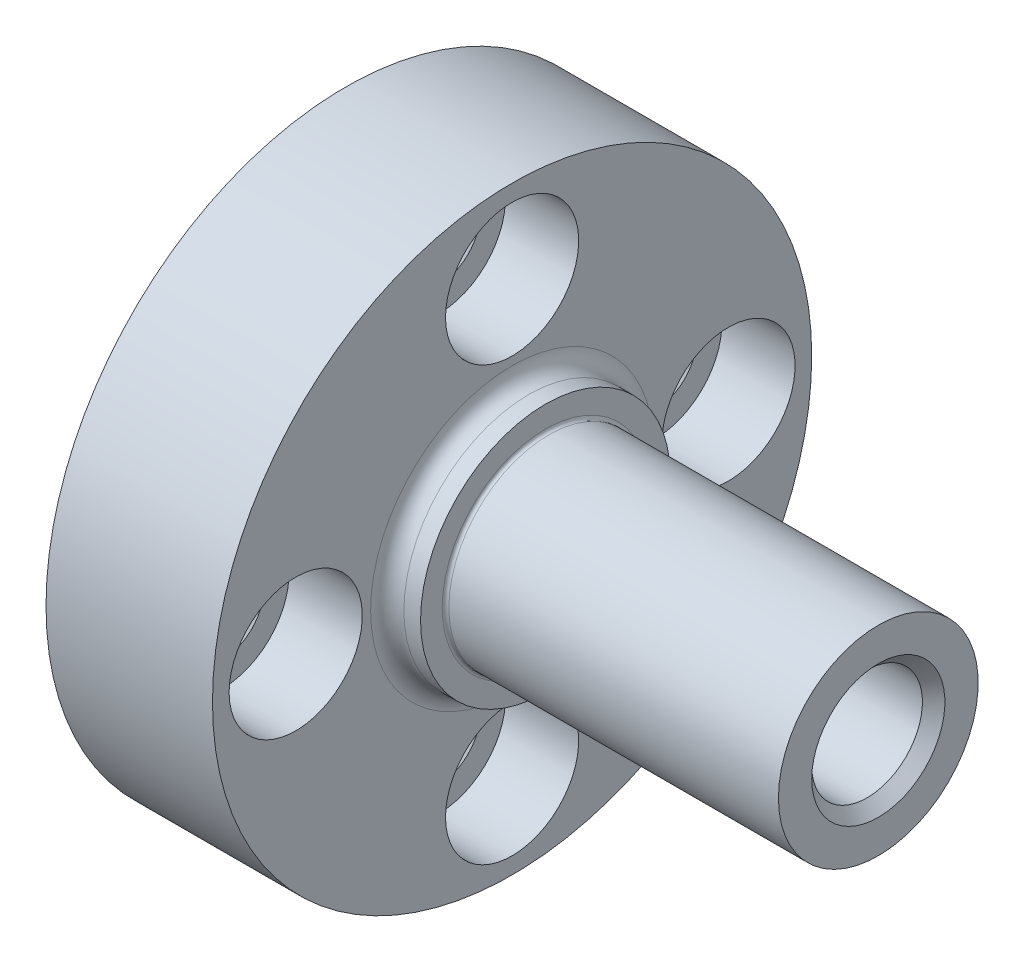
ISO-10303-21;
HEADER;
FILE_DESCRIPTION(('STEP AP214'),'2;1');
FILE_NAME('part.step','',(''),(''),'','','');
FILE_SCHEMA(('AUTOMOTIVE_DESIGN { 1 0 10303 214 1 1 1 1 }'));
ENDSEC;
DATA;
#1=APPLICATION_CONTEXT('core data for automotive mechanical design processes');
#2=APPLICATION_PROTOCOL_DEFINITION('international standard','automotive_design',2000,#1);
#3=PRODUCT_CONTEXT('',#1,'mechanical');
#4=PRODUCT('Part','Part','',(#3));
#5=PRODUCT_RELATED_PRODUCT_CATEGORY('part','',(#4));
#6=PRODUCT_DEFINITION_FORMATION('','',#4);
#7=PRODUCT_DEFINITION_CONTEXT('part definition',#1,'design');
#8=PRODUCT_DEFINITION('design','',#6,#7);
#9=PRODUCT_DEFINITION_SHAPE('','',#8);
#10=(LENGTH_UNIT() NAMED_UNIT(*) SI_UNIT(.MILLI.,.METRE.));
#11=(NAMED_UNIT(*) PLANE_ANGLE_UNIT() SI_UNIT($,.RADIAN.));
#12=(NAMED_UNIT(*) SI_UNIT($,.STERADIAN.) SOLID_ANGLE_UNIT());
#13=UNCERTAINTY_MEASURE_WITH_UNIT(LENGTH_MEASURE(1.E-05),#10,'distance_accuracy_value','');
#14=(GEOMETRIC_REPRESENTATION_CONTEXT(3) GLOBAL_UNCERTAINTY_ASSIGNED_CONTEXT((#13)) GLOBAL_UNIT_ASSIGNED_CONTEXT((#10,
#11,#12)) REPRESENTATION_CONTEXT('',''));
#15=CARTESIAN_POINT('',(0.,0.,0.));
#16=DIRECTION('',(0.,0.,1.));
#17=DIRECTION('',(1.,0.,0.));
#18=AXIS2_PLACEMENT_3D('',#15,#16,#17);
#19=CARTESIAN_POINT('',(32.,6.,0.));
#20=DIRECTION('',(-1.,0.,0.));
#21=DIRECTION('',(0.,0.,1.));
#22=AXIS2_PLACEMENT_3D('',#19,#20,#21);
#23=PLANE('',#22);
#24=CARTESIAN_POINT('',(32.,0.,0.));
#25=DIRECTION('',(-1.,0.,0.));
#26=DIRECTION('',(0.,0.,1.));
#27=AXIS2_PLACEMENT_3D('',#24,#25,#26);
#28=CIRCLE('',#27,6.);
#29=CARTESIAN_POINT('',(32.,0.,6.));
#30=VERTEX_POINT('',#29);
#31=EDGE_CURVE('E11',#30,#30,#28,.T.);
#32=ORIENTED_EDGE('',*,*,#31,.F.);
#33=EDGE_LOOP('',(#32));
#34=FACE_BOUND('',#33,.T.);
#35=CARTESIAN_POINT('',(32.,0.,0.));
#36=DIRECTION('',(-1.,0.,0.));
#37=DIRECTION('',(0.,0.,1.));
#38=AXIS2_PLACEMENT_3D('',#35,#36,#37);
#39=CIRCLE('',#38,4.);
#40=CARTESIAN_POINT('',(32.,0.,4.));
#41=VERTEX_POINT('',#40);
#42=EDGE_CURVE('E55',#41,#41,#39,.T.);
#43=ORIENTED_EDGE('',*,*,#42,.T.);
#44=EDGE_LOOP('',(#43));
#45=FACE_BOUND('',#44,.T.);
#46=ADVANCED_FACE('F34',(#34,#45),#23,.F.);
#47=CARTESIAN_POINT('',(10.,18.,0.));
#48=DIRECTION('',(-1.,0.,0.));
#49=DIRECTION('',(0.,0.,1.));
#50=AXIS2_PLACEMENT_3D('',#47,#48,#49);
#51=PLANE('',#50);
#52=CARTESIAN_POINT('',(10.,-13.,0.));
#53=DIRECTION('',(-1.,0.,0.));
#54=DIRECTION('',(0.,0.,1.));
#55=AXIS2_PLACEMENT_3D('',#52,#53,#54);
#56=CIRCLE('',#55,4.);
#57=CARTESIAN_POINT('',(10.,-13.,4.));
#58=VERTEX_POINT('',#57);
#59=EDGE_CURVE('E78',#58,#58,#56,.T.);
#60=ORIENTED_EDGE('',*,*,#59,.T.);
#61=EDGE_LOOP('',(#60));
#62=FACE_BOUND('',#61,.T.);
#63=CARTESIAN_POINT('',(10.,13.,0.));
#64=DIRECTION('',(-1.,0.,0.));
#65=DIRECTION('',(0.,0.,1.));
#66=AXIS2_PLACEMENT_3D('',#63,#64,#65);
#67=CIRCLE('',#66,4.);
#68=CARTESIAN_POINT('',(10.,13.,4.));
#69=VERTEX_POINT('',#68);
#70=EDGE_CURVE('E114',#69,#69,#67,.T.);
#71=ORIENTED_EDGE('',*,*,#70,.T.);
#72=EDGE_LOOP('',(#71));
#73=FACE_BOUND('',#72,.T.);
#74=CARTESIAN_POINT('',(10.,0.,0.));
#75=DIRECTION('',(-1.,0.,0.));
#76=DIRECTION('',(0.,0.,1.));
#77=AXIS2_PLACEMENT_3D('',#74,#75,#76);
#78=CIRCLE('',#77,18.);
#79=CARTESIAN_POINT('',(10.,0.,18.));
#80=VERTEX_POINT('',#79);
#81=EDGE_CURVE('E135',#80,#80,#78,.T.);
#82=ORIENTED_EDGE('',*,*,#81,.F.);
#83=EDGE_LOOP('',(#82));
#84=FACE_BOUND('',#83,.T.);
#85=CARTESIAN_POINT('',(10.,0.,0.));
#86=DIRECTION('',(-1.,0.,0.));
#87=DIRECTION('',(0.,0.,1.));
#88=AXIS2_PLACEMENT_3D('',#85,#86,#87);
#89=CIRCLE('',#88,8.5);
#90=CARTESIAN_POINT('',(10.,0.,8.5));
#91=VERTEX_POINT('',#90);
#92=EDGE_CURVE('E138',#91,#91,#89,.T.);
#93=ORIENTED_EDGE('',*,*,#92,.T.);
#94=EDGE_LOOP('',(#93));
#95=FACE_BOUND('',#94,.T.);
#96=CARTESIAN_POINT('',(10.,0.,13.));
#97=DIRECTION('',(-1.,0.,0.));
#98=DIRECTION('',(0.,0.,1.));
#99=AXIS2_PLACEMENT_3D('',#96,#97,#98);
#100=CIRCLE('',#99,4.);
#101=CARTESIAN_POINT('',(10.,0.,17.));
#102=VERTEX_POINT('',#101);
#103=EDGE_CURVE('E96',#102,#102,#100,.T.);
#104=ORIENTED_EDGE('',*,*,#103,.T.);
#105=EDGE_LOOP('',(#104));
#106=FACE_BOUND('',#105,.T.);
#107=CARTESIAN_POINT('',(10.,0.,-13.));
#108=DIRECTION('',(-1.,0.,0.));
#109=DIRECTION('',(0.,0.,1.));
#110=AXIS2_PLACEMENT_3D('',#107,#108,#109);
#111=CIRCLE('',#110,4.);
#112=CARTESIAN_POINT('',(10.,0.,-9.));
#113=VERTEX_POINT('',#112);
#114=EDGE_CURVE('E60',#113,#113,#111,.T.);
#115=ORIENTED_EDGE('',*,*,#114,.T.);
#116=EDGE_LOOP('',(#115));
#117=FACE_BOUND('',#116,.T.);
#118=ADVANCED_FACE('F162',(#62,#73,#84,#95,#106,#117),#51,.F.);
#119=CARTESIAN_POINT('',(0.,0.,0.));
#120=DIRECTION('',(1.,0.,0.));
#121=DIRECTION('',(0.,0.,-1.));
#122=AXIS2_PLACEMENT_3D('',#119,#120,#121);
#123=PLANE('',#122);
#124=CARTESIAN_POINT('',(0.,-13.,0.));
#125=DIRECTION('',(-1.,0.,0.));
#126=DIRECTION('',(0.,0.,1.));
#127=AXIS2_PLACEMENT_3D('',#124,#125,#126);
#128=CIRCLE('',#127,2.5);
#129=CARTESIAN_POINT('',(0.,-13.,2.5));
#130=VERTEX_POINT('',#129);
#131=EDGE_CURVE('E93',#130,#130,#128,.T.);
#132=ORIENTED_EDGE('',*,*,#131,.F.);
#133=EDGE_LOOP('',(#132));
#134=FACE_BOUND('',#133,.T.);
#135=CARTESIAN_POINT('',(0.,13.,0.));
#136=DIRECTION('',(-1.,0.,0.));
#137=DIRECTION('',(0.,0.,1.));
#138=AXIS2_PLACEMENT_3D('',#135,#136,#137);
#139=CIRCLE('',#138,2.5);
#140=CARTESIAN_POINT('',(0.,13.,2.5));
#141=VERTEX_POINT('',#140);
#142=EDGE_CURVE('E129',#141,#141,#139,.T.);
#143=ORIENTED_EDGE('',*,*,#142,.F.);
#144=EDGE_LOOP('',(#143));
#145=FACE_BOUND('',#144,.T.);
#146=CARTESIAN_POINT('',(0.,0.,0.));
#147=DIRECTION('',(-1.,0.,0.));
#148=DIRECTION('',(0.,0.,1.));
#149=AXIS2_PLACEMENT_3D('',#146,#147,#148);
#150=CIRCLE('',#149,18.);
#151=CARTESIAN_POINT('',(0.,0.,18.));
#152=VERTEX_POINT('',#151);
#153=EDGE_CURVE('E132',#152,#152,#150,.T.);
#154=ORIENTED_EDGE('',*,*,#153,.T.);
#155=EDGE_LOOP('',(#154));
#156=FACE_BOUND('',#155,.T.);
#157=CARTESIAN_POINT('',(0.,0.,13.));
#158=DIRECTION('',(-1.,0.,0.));
#159=DIRECTION('',(0.,0.,1.));
#160=AXIS2_PLACEMENT_3D('',#157,#158,#159);
#161=CIRCLE('',#160,2.5);
#162=CARTESIAN_POINT('',(0.,0.,15.5));
#163=VERTEX_POINT('',#162);
#164=EDGE_CURVE('E111',#163,#163,#161,.T.);
#165=ORIENTED_EDGE('',*,*,#164,.F.);
#166=EDGE_LOOP('',(#165));
#167=FACE_BOUND('',#166,.T.);
#168=CARTESIAN_POINT('',(0.,0.,-13.));
#169=DIRECTION('',(-1.,0.,0.));
#170=DIRECTION('',(0.,0.,1.));
#171=AXIS2_PLACEMENT_3D('',#168,#169,#170);
#172=CIRCLE('',#171,2.5);
#173=CARTESIAN_POINT('',(0.,0.,-10.5));
#174=VERTEX_POINT('',#173);
#175=EDGE_CURVE('E75',#174,#174,#172,.T.);
#176=ORIENTED_EDGE('',*,*,#175,.F.);
#177=EDGE_LOOP('',(#176));
#178=FACE_BOUND('',#177,.T.);
#179=ADVANCED_FACE('F157',(#134,#145,#156,#167,#178),#123,.F.);
#180=CARTESIAN_POINT('',(32.,0.,0.));
#181=DIRECTION('',(-1.,0.,0.));
#182=DIRECTION('',(0.,0.,1.));
#183=AXIS2_PLACEMENT_3D('',#180,#181,#182);
#184=CYLINDRICAL_SURFACE('',#183,6.);
#185=CARTESIAN_POINT('',(12.2,0.,0.));
#186=DIRECTION('',(-1.,0.,0.));
#187=DIRECTION('',(0.,0.,1.));
#188=AXIS2_PLACEMENT_3D('',#185,#186,#187);
#189=CIRCLE('',#188,6.);
#190=CARTESIAN_POINT('',(12.2,0.,6.));
#191=VERTEX_POINT('',#190);
#192=EDGE_CURVE('E40',#191,#191,#189,.T.);
#193=ORIENTED_EDGE('',*,*,#192,.F.);
#194=EDGE_LOOP('',(#193));
#195=FACE_BOUND('',#194,.T.);
#196=ORIENTED_EDGE('',*,*,#31,.T.);
#197=EDGE_LOOP('',(#196));
#198=FACE_BOUND('',#197,.T.);
#199=ADVANCED_FACE('F154',(#195,#198),#184,.T.);
#200=CARTESIAN_POINT('',(12.2000000000005,0.,0.));
#201=DIRECTION('',(-1.,0.,0.));
#202=DIRECTION('',(0.,0.,1.));
#203=AXIS2_PLACEMENT_3D('',#200,#201,#202);
#204=TOROIDAL_SURFACE('',#203,6.20000000000054,0.200000000000543);
#205=CARTESIAN_POINT('',(12.,0.,0.));
#206=DIRECTION('',(-1.,0.,0.));
#207=DIRECTION('',(0.,0.,1.));
#208=AXIS2_PLACEMENT_3D('',#205,#206,#207);
#209=CIRCLE('',#208,6.2);
#210=CARTESIAN_POINT('',(12.,0.,6.2));
#211=VERTEX_POINT('',#210);
#212=EDGE_CURVE('E147',#211,#211,#209,.T.);
#213=ORIENTED_EDGE('',*,*,#212,.F.);
#214=EDGE_LOOP('',(#213));
#215=FACE_BOUND('',#214,.T.);
#216=ORIENTED_EDGE('',*,*,#192,.T.);
#217=EDGE_LOOP('',(#216));
#218=FACE_BOUND('',#217,.T.);
#219=ADVANCED_FACE('F152',(#215,#218),#204,.F.);
#220=CARTESIAN_POINT('',(12.,7.5,0.));
#221=DIRECTION('',(-1.,0.,0.));
#222=DIRECTION('',(0.,0.,1.));
#223=AXIS2_PLACEMENT_3D('',#220,#221,#222);
#224=PLANE('',#223);
#225=CARTESIAN_POINT('',(12.,0.,0.));
#226=DIRECTION('',(-1.,0.,0.));
#227=DIRECTION('',(0.,0.,1.));
#228=AXIS2_PLACEMENT_3D('',#225,#226,#227);
#229=CIRCLE('',#228,7.5);
#230=CARTESIAN_POINT('',(12.,0.,7.5));
#231=VERTEX_POINT('',#230);
#232=EDGE_CURVE('E144',#231,#231,#229,.T.);
#233=ORIENTED_EDGE('',*,*,#232,.F.);
#234=EDGE_LOOP('',(#233));
#235=FACE_BOUND('',#234,.T.);
#236=ORIENTED_EDGE('',*,*,#212,.T.);
#237=EDGE_LOOP('',(#236));
#238=FACE_BOUND('',#237,.T.);
#239=ADVANCED_FACE('F271',(#235,#238),#224,.F.);
#240=CARTESIAN_POINT('',(32.,0.,0.));
#241=DIRECTION('',(-1.,0.,0.));
#242=DIRECTION('',(0.,0.,1.));
#243=AXIS2_PLACEMENT_3D('',#240,#241,#242);
#244=CYLINDRICAL_SURFACE('',#243,7.5);
#245=CARTESIAN_POINT('',(11.,0.,0.));
#246=DIRECTION('',(-1.,0.,0.));
#247=DIRECTION('',(0.,0.,1.));
#248=AXIS2_PLACEMENT_3D('',#245,#246,#247);
#249=CIRCLE('',#248,7.5);
#250=CARTESIAN_POINT('',(11.,0.,7.5));
#251=VERTEX_POINT('',#250);
#252=EDGE_CURVE('E141',#251,#251,#249,.T.);
#253=ORIENTED_EDGE('',*,*,#252,.F.);
#254=EDGE_LOOP('',(#253));
#255=FACE_BOUND('',#254,.T.);
#256=ORIENTED_EDGE('',*,*,#232,.T.);
#257=EDGE_LOOP('',(#256));
#258=FACE_BOUND('',#257,.T.);
#259=ADVANCED_FACE('F267',(#255,#258),#244,.T.);
#260=CARTESIAN_POINT('',(10.9999999999993,0.,0.));
#261=DIRECTION('',(-1.,0.,0.));
#262=DIRECTION('',(0.,0.,1.));
#263=AXIS2_PLACEMENT_3D('',#260,#261,#262);
#264=TOROIDAL_SURFACE('',#263,8.49999999999931,0.999999999999309);
#265=ORIENTED_EDGE('',*,*,#92,.F.);
#266=EDGE_LOOP('',(#265));
#267=FACE_BOUND('',#266,.T.);
#268=ORIENTED_EDGE('',*,*,#252,.T.);
#269=EDGE_LOOP('',(#268));
#270=FACE_BOUND('',#269,.T.);
#271=ADVANCED_FACE('F260',(#267,#270),#264,.F.);
#272=CARTESIAN_POINT('',(32.,0.,0.));
#273=DIRECTION('',(-1.,0.,0.));
#274=DIRECTION('',(0.,0.,1.));
#275=AXIS2_PLACEMENT_3D('',#272,#273,#274);
#276=CYLINDRICAL_SURFACE('',#275,18.);
#277=ORIENTED_EDGE('',*,*,#153,.F.);
#278=EDGE_LOOP('',(#277));
#279=FACE_BOUND('',#278,.T.);
#280=ORIENTED_EDGE('',*,*,#81,.T.);
#281=EDGE_LOOP('',(#280));
#282=FACE_BOUND('',#281,.T.);
#283=ADVANCED_FACE('F253',(#279,#282),#276,.T.);
#284=CARTESIAN_POINT('',(0.432999999999999,13.,0.));
#285=DIRECTION('',(-1.,0.,0.));
#286=DIRECTION('',(0.,0.,1.));
#287=AXIS2_PLACEMENT_3D('',#284,#285,#286);
#288=CONICAL_SURFACE('',#287,2.067,0.785398163397448);
#289=ORIENTED_EDGE('',*,*,#142,.T.);
#290=EDGE_LOOP('',(#289));
#291=FACE_BOUND('',#290,.T.);
#292=CARTESIAN_POINT('',(0.432999999999999,13.,0.));
#293=DIRECTION('',(-1.,0.,0.));
#294=DIRECTION('',(0.,0.,1.));
#295=AXIS2_PLACEMENT_3D('',#292,#293,#294);
#296=CIRCLE('',#295,2.067);
#297=CARTESIAN_POINT('',(0.432999999999999,13.,2.067));
#298=VERTEX_POINT('',#297);
#299=EDGE_CURVE('E126',#298,#298,#296,.T.);
#300=ORIENTED_EDGE('',*,*,#299,.F.);
#301=EDGE_LOOP('',(#300));
#302=FACE_BOUND('',#301,.T.);
#303=ADVANCED_FACE('F249',(#291,#302),#288,.F.);
#304=CARTESIAN_POINT('',(10.,13.,0.));
#305=DIRECTION('',(-1.,0.,0.));
#306=DIRECTION('',(0.,0.,1.));
#307=AXIS2_PLACEMENT_3D('',#304,#305,#306);
#308=CYLINDRICAL_SURFACE('',#307,2.067);
#309=ORIENTED_EDGE('',*,*,#299,.T.);
#310=EDGE_LOOP('',(#309));
#311=FACE_BOUND('',#310,.T.);
#312=CARTESIAN_POINT('',(5.167,13.,0.));
#313=DIRECTION('',(-1.,0.,0.));
#314=DIRECTION('',(0.,0.,1.));
#315=AXIS2_PLACEMENT_3D('',#312,#313,#314);
#316=CIRCLE('',#315,2.067);
#317=CARTESIAN_POINT('',(5.167,13.,2.067));
#318=VERTEX_POINT('',#317);
#319=EDGE_CURVE('E123',#318,#318,#316,.T.);
#320=ORIENTED_EDGE('',*,*,#319,.F.);
#321=EDGE_LOOP('',(#320));
#322=FACE_BOUND('',#321,.T.);
#323=ADVANCED_FACE('F245',(#311,#322),#308,.F.);
#324=CARTESIAN_POINT('',(5.6,13.,0.));
#325=DIRECTION('',(1.,0.,0.));
#326=DIRECTION('',(0.,0.,-1.));
#327=AXIS2_PLACEMENT_3D('',#324,#325,#326);
#328=CONICAL_SURFACE('',#327,2.5,0.785398163397447);
#329=ORIENTED_EDGE('',*,*,#319,.T.);
#330=EDGE_LOOP('',(#329));
#331=FACE_BOUND('',#330,.T.);
#332=CARTESIAN_POINT('',(5.6,13.,0.));
#333=DIRECTION('',(-1.,0.,0.));
#334=DIRECTION('',(0.,0.,1.));
#335=AXIS2_PLACEMENT_3D('',#332,#333,#334);
#336=CIRCLE('',#335,2.5);
#337=CARTESIAN_POINT('',(5.6,13.,2.5));
#338=VERTEX_POINT('',#337);
#339=EDGE_CURVE('E120',#338,#338,#336,.T.);
#340=ORIENTED_EDGE('',*,*,#339,.F.);
#341=EDGE_LOOP('',(#340));
#342=FACE_BOUND('',#341,.T.);
#343=ADVANCED_FACE('F241',(#331,#342),#328,.F.);
#344=CARTESIAN_POINT('',(5.6,15.5,0.));
#345=DIRECTION('',(1.,0.,0.));
#346=DIRECTION('',(0.,0.,-1.));
#347=AXIS2_PLACEMENT_3D('',#344,#345,#346);
#348=PLANE('',#347);
#349=ORIENTED_EDGE('',*,*,#339,.T.);
#350=EDGE_LOOP('',(#349));
#351=FACE_BOUND('',#350,.T.);
#352=CARTESIAN_POINT('',(5.6,13.,0.));
#353=DIRECTION('',(-1.,0.,0.));
#354=DIRECTION('',(0.,0.,1.));
#355=AXIS2_PLACEMENT_3D('',#352,#353,#354);
#356=CIRCLE('',#355,4.);
#357=CARTESIAN_POINT('',(5.6,13.,4.));
#358=VERTEX_POINT('',#357);
#359=EDGE_CURVE('E117',#358,#358,#356,.T.);
#360=ORIENTED_EDGE('',*,*,#359,.F.);
#361=EDGE_LOOP('',(#360));
#362=FACE_BOUND('',#361,.T.);
#363=ADVANCED_FACE('F237',(#351,#362),#348,.T.);
#364=CARTESIAN_POINT('',(10.,13.,0.));
#365=DIRECTION('',(-1.,0.,0.));
#366=DIRECTION('',(0.,0.,1.));
#367=AXIS2_PLACEMENT_3D('',#364,#365,#366);
#368=CYLINDRICAL_SURFACE('',#367,4.);
#369=ORIENTED_EDGE('',*,*,#359,.T.);
#370=EDGE_LOOP('',(#369));
#371=FACE_BOUND('',#370,.T.);
#372=ORIENTED_EDGE('',*,*,#70,.F.);
#373=EDGE_LOOP('',(#372));
#374=FACE_BOUND('',#373,.T.);
#375=ADVANCED_FACE('F233',(#371,#374),#368,.F.);
#376=CARTESIAN_POINT('',(0.432999999999999,0.,13.));
#377=DIRECTION('',(-1.,0.,0.));
#378=DIRECTION('',(0.,0.,1.));
#379=AXIS2_PLACEMENT_3D('',#376,#377,#378);
#380=CONICAL_SURFACE('',#379,2.067,0.785398163397448);
#381=ORIENTED_EDGE('',*,*,#164,.T.);
#382=EDGE_LOOP('',(#381));
#383=FACE_BOUND('',#382,.T.);
#384=CARTESIAN_POINT('',(0.432999999999999,0.,13.));
#385=DIRECTION('',(-1.,0.,0.));
#386=DIRECTION('',(0.,0.,1.));
#387=AXIS2_PLACEMENT_3D('',#384,#385,#386);
#388=CIRCLE('',#387,2.067);
#389=CARTESIAN_POINT('',(0.432999999999999,0.,15.067));
#390=VERTEX_POINT('',#389);
#391=EDGE_CURVE('E108',#390,#390,#388,.T.);
#392=ORIENTED_EDGE('',*,*,#391,.F.);
#393=EDGE_LOOP('',(#392));
#394=FACE_BOUND('',#393,.T.);
#395=ADVANCED_FACE('F229',(#383,#394),#380,.F.);
#396=CARTESIAN_POINT('',(10.,0.,13.));
#397=DIRECTION('',(-1.,0.,0.));
#398=DIRECTION('',(0.,0.,1.));
#399=AXIS2_PLACEMENT_3D('',#396,#397,#398);
#400=CYLINDRICAL_SURFACE('',#399,2.067);
#401=ORIENTED_EDGE('',*,*,#391,.T.);
#402=EDGE_LOOP('',(#401));
#403=FACE_BOUND('',#402,.T.);
#404=CARTESIAN_POINT('',(5.167,0.,13.));
#405=DIRECTION('',(-1.,0.,0.));
#406=DIRECTION('',(0.,0.,1.));
#407=AXIS2_PLACEMENT_3D('',#404,#405,#406);
#408=CIRCLE('',#407,2.067);
#409=CARTESIAN_POINT('',(5.167,0.,15.067));
#410=VERTEX_POINT('',#409);
#411=EDGE_CURVE('E105',#410,#410,#408,.T.);
#412=ORIENTED_EDGE('',*,*,#411,.F.);
#413=EDGE_LOOP('',(#412));
#414=FACE_BOUND('',#413,.T.);
#415=ADVANCED_FACE('F225',(#403,#414),#400,.F.);
#416=CARTESIAN_POINT('',(5.6,0.,13.));
#417=DIRECTION('',(1.,0.,0.));
#418=DIRECTION('',(0.,0.,-1.));
#419=AXIS2_PLACEMENT_3D('',#416,#417,#418);
#420=CONICAL_SURFACE('',#419,2.5,0.785398163397447);
#421=ORIENTED_EDGE('',*,*,#411,.T.);
#422=EDGE_LOOP('',(#421));
#423=FACE_BOUND('',#422,.T.);
#424=CARTESIAN_POINT('',(5.6,0.,13.));
#425=DIRECTION('',(-1.,0.,0.));
#426=DIRECTION('',(0.,0.,1.));
#427=AXIS2_PLACEMENT_3D('',#424,#425,#426);
#428=CIRCLE('',#427,2.5);
#429=CARTESIAN_POINT('',(5.6,0.,15.5));
#430=VERTEX_POINT('',#429);
#431=EDGE_CURVE('E102',#430,#430,#428,.T.);
#432=ORIENTED_EDGE('',*,*,#431,.F.);
#433=EDGE_LOOP('',(#432));
#434=FACE_BOUND('',#433,.T.);
#435=ADVANCED_FACE('F221',(#423,#434),#420,.F.);
#436=CARTESIAN_POINT('',(5.6,2.5,13.));
#437=DIRECTION('',(1.,0.,0.));
#438=DIRECTION('',(0.,0.,-1.));
#439=AXIS2_PLACEMENT_3D('',#436,#437,#438);
#440=PLANE('',#439);
#441=ORIENTED_EDGE('',*,*,#431,.T.);
#442=EDGE_LOOP('',(#441));
#443=FACE_BOUND('',#442,.T.);
#444=CARTESIAN_POINT('',(5.6,0.,13.));
#445=DIRECTION('',(-1.,0.,0.));
#446=DIRECTION('',(0.,0.,1.));
#447=AXIS2_PLACEMENT_3D('',#444,#445,#446);
#448=CIRCLE('',#447,4.);
#449=CARTESIAN_POINT('',(5.6,0.,17.));
#450=VERTEX_POINT('',#449);
#451=EDGE_CURVE('E99',#450,#450,#448,.T.);
#452=ORIENTED_EDGE('',*,*,#451,.F.);
#453=EDGE_LOOP('',(#452));
#454=FACE_BOUND('',#453,.T.);
#455=ADVANCED_FACE('F217',(#443,#454),#440,.T.);
#456=CARTESIAN_POINT('',(10.,0.,13.));
#457=DIRECTION('',(-1.,0.,0.));
#458=DIRECTION('',(0.,0.,1.));
#459=AXIS2_PLACEMENT_3D('',#456,#457,#458);
#460=CYLINDRICAL_SURFACE('',#459,4.);
#461=ORIENTED_EDGE('',*,*,#451,.T.);
#462=EDGE_LOOP('',(#461));
#463=FACE_BOUND('',#462,.T.);
#464=ORIENTED_EDGE('',*,*,#103,.F.);
#465=EDGE_LOOP('',(#464));
#466=FACE_BOUND('',#465,.T.);
#467=ADVANCED_FACE('F213',(#463,#466),#460,.F.);
#468=CARTESIAN_POINT('',(0.432999999999999,-13.,0.));
#469=DIRECTION('',(-1.,0.,0.));
#470=DIRECTION('',(0.,0.,1.));
#471=AXIS2_PLACEMENT_3D('',#468,#469,#470);
#472=CONICAL_SURFACE('',#471,2.067,0.785398163397448);
#473=ORIENTED_EDGE('',*,*,#131,.T.);
#474=EDGE_LOOP('',(#473));
#475=FACE_BOUND('',#474,.T.);
#476=CARTESIAN_POINT('',(0.432999999999999,-13.,0.));
#477=DIRECTION('',(-1.,0.,0.));
#478=DIRECTION('',(0.,0.,1.));
#479=AXIS2_PLACEMENT_3D('',#476,#477,#478);
#480=CIRCLE('',#479,2.067);
#481=CARTESIAN_POINT('',(0.432999999999999,-13.,2.067));
#482=VERTEX_POINT('',#481);
#483=EDGE_CURVE('E90',#482,#482,#480,.T.);
#484=ORIENTED_EDGE('',*,*,#483,.F.);
#485=EDGE_LOOP('',(#484));
#486=FACE_BOUND('',#485,.T.);
#487=ADVANCED_FACE('F209',(#475,#486),#472,.F.);
#488=CARTESIAN_POINT('',(10.,-13.,0.));
#489=DIRECTION('',(-1.,0.,0.));
#490=DIRECTION('',(0.,0.,1.));
#491=AXIS2_PLACEMENT_3D('',#488,#489,#490);
#492=CYLINDRICAL_SURFACE('',#491,2.067);
#493=ORIENTED_EDGE('',*,*,#483,.T.);
#494=EDGE_LOOP('',(#493));
#495=FACE_BOUND('',#494,.T.);
#496=CARTESIAN_POINT('',(5.167,-13.,0.));
#497=DIRECTION('',(-1.,0.,0.));
#498=DIRECTION('',(0.,0.,1.));
#499=AXIS2_PLACEMENT_3D('',#496,#497,#498);
#500=CIRCLE('',#499,2.067);
#501=CARTESIAN_POINT('',(5.167,-13.,2.067));
#502=VERTEX_POINT('',#501);
#503=EDGE_CURVE('E87',#502,#502,#500,.T.);
#504=ORIENTED_EDGE('',*,*,#503,.F.);
#505=EDGE_LOOP('',(#504));
#506=FACE_BOUND('',#505,.T.);
#507=ADVANCED_FACE('F205',(#495,#506),#492,.F.);
#508=CARTESIAN_POINT('',(5.6,-13.,0.));
#509=DIRECTION('',(1.,0.,0.));
#510=DIRECTION('',(0.,0.,-1.));
#511=AXIS2_PLACEMENT_3D('',#508,#509,#510);
#512=CONICAL_SURFACE('',#511,2.5,0.785398163397447);
#513=ORIENTED_EDGE('',*,*,#503,.T.);
#514=EDGE_LOOP('',(#513));
#515=FACE_BOUND('',#514,.T.);
#516=CARTESIAN_POINT('',(5.6,-13.,0.));
#517=DIRECTION('',(-1.,0.,0.));
#518=DIRECTION('',(0.,0.,1.));
#519=AXIS2_PLACEMENT_3D('',#516,#517,#518);
#520=CIRCLE('',#519,2.5);
#521=CARTESIAN_POINT('',(5.6,-13.,2.5));
#522=VERTEX_POINT('',#521);
#523=EDGE_CURVE('E84',#522,#522,#520,.T.);
#524=ORIENTED_EDGE('',*,*,#523,.F.);
#525=EDGE_LOOP('',(#524));
#526=FACE_BOUND('',#525,.T.);
#527=ADVANCED_FACE('F201',(#515,#526),#512,.F.);
#528=CARTESIAN_POINT('',(5.6,-10.5,0.));
#529=DIRECTION('',(1.,0.,0.));
#530=DIRECTION('',(0.,0.,-1.));
#531=AXIS2_PLACEMENT_3D('',#528,#529,#530);
#532=PLANE('',#531);
#533=ORIENTED_EDGE('',*,*,#523,.T.);
#534=EDGE_LOOP('',(#533));
#535=FACE_BOUND('',#534,.T.);
#536=CARTESIAN_POINT('',(5.6,-13.,0.));
#537=DIRECTION('',(-1.,0.,0.));
#538=DIRECTION('',(0.,0.,1.));
#539=AXIS2_PLACEMENT_3D('',#536,#537,#538);
#540=CIRCLE('',#539,4.);
#541=CARTESIAN_POINT('',(5.6,-13.,4.));
#542=VERTEX_POINT('',#541);
#543=EDGE_CURVE('E81',#542,#542,#540,.T.);
#544=ORIENTED_EDGE('',*,*,#543,.F.);
#545=EDGE_LOOP('',(#544));
#546=FACE_BOUND('',#545,.T.);
#547=ADVANCED_FACE('F197',(#535,#546),#532,.T.);
#548=CARTESIAN_POINT('',(10.,-13.,0.));
#549=DIRECTION('',(-1.,0.,0.));
#550=DIRECTION('',(0.,0.,1.));
#551=AXIS2_PLACEMENT_3D('',#548,#549,#550);
#552=CYLINDRICAL_SURFACE('',#551,4.);
#553=ORIENTED_EDGE('',*,*,#543,.T.);
#554=EDGE_LOOP('',(#553));
#555=FACE_BOUND('',#554,.T.);
#556=ORIENTED_EDGE('',*,*,#59,.F.);
#557=EDGE_LOOP('',(#556));
#558=FACE_BOUND('',#557,.T.);
#559=ADVANCED_FACE('F193',(#555,#558),#552,.F.);
#560=CARTESIAN_POINT('',(0.432999999999999,0.,-13.));
#561=DIRECTION('',(-1.,0.,0.));
#562=DIRECTION('',(0.,0.,1.));
#563=AXIS2_PLACEMENT_3D('',#560,#561,#562);
#564=CONICAL_SURFACE('',#563,2.067,0.785398163397448);
#565=ORIENTED_EDGE('',*,*,#175,.T.);
#566=EDGE_LOOP('',(#565));
#567=FACE_BOUND('',#566,.T.);
#568=CARTESIAN_POINT('',(0.432999999999999,0.,-13.));
#569=DIRECTION('',(-1.,0.,0.));
#570=DIRECTION('',(0.,0.,1.));
#571=AXIS2_PLACEMENT_3D('',#568,#569,#570);
#572=CIRCLE('',#571,2.067);
#573=CARTESIAN_POINT('',(0.432999999999999,0.,-10.933));
#574=VERTEX_POINT('',#573);
#575=EDGE_CURVE('E72',#574,#574,#572,.T.);
#576=ORIENTED_EDGE('',*,*,#575,.F.);
#577=EDGE_LOOP('',(#576));
#578=FACE_BOUND('',#577,.T.);
#579=ADVANCED_FACE('F189',(#567,#578),#564,.F.);
#580=CARTESIAN_POINT('',(10.,0.,-13.));
#581=DIRECTION('',(-1.,0.,0.));
#582=DIRECTION('',(0.,0.,1.));
#583=AXIS2_PLACEMENT_3D('',#580,#581,#582);
#584=CYLINDRICAL_SURFACE('',#583,2.067);
#585=ORIENTED_EDGE('',*,*,#575,.T.);
#586=EDGE_LOOP('',(#585));
#587=FACE_BOUND('',#586,.T.);
#588=CARTESIAN_POINT('',(5.167,0.,-13.));
#589=DIRECTION('',(-1.,0.,0.));
#590=DIRECTION('',(0.,0.,1.));
#591=AXIS2_PLACEMENT_3D('',#588,#589,#590);
#592=CIRCLE('',#591,2.067);
#593=CARTESIAN_POINT('',(5.167,0.,-10.933));
#594=VERTEX_POINT('',#593);
#595=EDGE_CURVE('E69',#594,#594,#592,.T.);
#596=ORIENTED_EDGE('',*,*,#595,.F.);
#597=EDGE_LOOP('',(#596));
#598=FACE_BOUND('',#597,.T.);
#599=ADVANCED_FACE('F185',(#587,#598),#584,.F.);
#600=CARTESIAN_POINT('',(5.6,0.,-13.));
#601=DIRECTION('',(1.,0.,0.));
#602=DIRECTION('',(0.,0.,-1.));
#603=AXIS2_PLACEMENT_3D('',#600,#601,#602);
#604=CONICAL_SURFACE('',#603,2.5,0.785398163397447);
#605=ORIENTED_EDGE('',*,*,#595,.T.);
#606=EDGE_LOOP('',(#605));
#607=FACE_BOUND('',#606,.T.);
#608=CARTESIAN_POINT('',(5.6,0.,-13.));
#609=DIRECTION('',(-1.,0.,0.));
#610=DIRECTION('',(0.,0.,1.));
#611=AXIS2_PLACEMENT_3D('',#608,#609,#610);
#612=CIRCLE('',#611,2.5);
#613=CARTESIAN_POINT('',(5.6,0.,-10.5));
#614=VERTEX_POINT('',#613);
#615=EDGE_CURVE('E66',#614,#614,#612,.T.);
#616=ORIENTED_EDGE('',*,*,#615,.F.);
#617=EDGE_LOOP('',(#616));
#618=FACE_BOUND('',#617,.T.);
#619=ADVANCED_FACE('F181',(#607,#618),#604,.F.);
#620=CARTESIAN_POINT('',(5.6,2.5,-13.));
#621=DIRECTION('',(1.,0.,0.));
#622=DIRECTION('',(0.,0.,-1.));
#623=AXIS2_PLACEMENT_3D('',#620,#621,#622);
#624=PLANE('',#623);
#625=ORIENTED_EDGE('',*,*,#615,.T.);
#626=EDGE_LOOP('',(#625));
#627=FACE_BOUND('',#626,.T.);
#628=CARTESIAN_POINT('',(5.6,0.,-13.));
#629=DIRECTION('',(-1.,0.,0.));
#630=DIRECTION('',(0.,0.,1.));
#631=AXIS2_PLACEMENT_3D('',#628,#629,#630);
#632=CIRCLE('',#631,4.);
#633=CARTESIAN_POINT('',(5.6,0.,-9.));
#634=VERTEX_POINT('',#633);
#635=EDGE_CURVE('E63',#634,#634,#632,.T.);
#636=ORIENTED_EDGE('',*,*,#635,.F.);
#637=EDGE_LOOP('',(#636));
#638=FACE_BOUND('',#637,.T.);
#639=ADVANCED_FACE('F175',(#627,#638),#624,.T.);
#640=CARTESIAN_POINT('',(10.,0.,-13.));
#641=DIRECTION('',(-1.,0.,0.));
#642=DIRECTION('',(0.,0.,1.));
#643=AXIS2_PLACEMENT_3D('',#640,#641,#642);
#644=CYLINDRICAL_SURFACE('',#643,4.);
#645=ORIENTED_EDGE('',*,*,#635,.T.);
#646=EDGE_LOOP('',(#645));
#647=FACE_BOUND('',#646,.T.);
#648=ORIENTED_EDGE('',*,*,#114,.F.);
#649=EDGE_LOOP('',(#648));
#650=FACE_BOUND('',#649,.T.);
#651=ADVANCED_FACE('F167',(#647,#650),#644,.F.);
#652=CARTESIAN_POINT('',(32.,0.,0.));
#653=DIRECTION('',(1.,0.,0.));
#654=DIRECTION('',(0.,0.,-1.));
#655=AXIS2_PLACEMENT_3D('',#652,#653,#654);
#656=CONICAL_SURFACE('',#655,4.,0.785398163397446);
#657=CARTESIAN_POINT('',(31.3235,0.,0.));
#658=DIRECTION('',(-1.,0.,0.));
#659=DIRECTION('',(0.,0.,1.));
#660=AXIS2_PLACEMENT_3D('',#657,#658,#659);
#661=CIRCLE('',#660,3.3235);
#662=CARTESIAN_POINT('',(31.3235,0.,3.3235));
#663=VERTEX_POINT('',#662);
#664=EDGE_CURVE('E52',#663,#663,#661,.T.);
#665=ORIENTED_EDGE('',*,*,#664,.T.);
#666=EDGE_LOOP('',(#665));
#667=FACE_BOUND('',#666,.T.);
#668=ORIENTED_EDGE('',*,*,#42,.F.);
#669=EDGE_LOOP('',(#668));
#670=FACE_BOUND('',#669,.T.);
#671=ADVANCED_FACE('F165',(#667,#670),#656,.F.);
#672=CARTESIAN_POINT('',(32.,0.,0.));
#673=DIRECTION('',(-1.,0.,0.));
#674=DIRECTION('',(0.,0.,1.));
#675=AXIS2_PLACEMENT_3D('',#672,#673,#674);
#676=CYLINDRICAL_SURFACE('',#675,3.3235);
#677=CARTESIAN_POINT('',(8.9188236196517,0.,0.));
#678=DIRECTION('',(-1.,0.,0.));
#679=DIRECTION('',(0.,0.,1.));
#680=AXIS2_PLACEMENT_3D('',#677,#678,#679);
#681=CIRCLE('',#680,3.3235);
#682=CARTESIAN_POINT('',(8.9188236196517,0.,3.3235));
#683=VERTEX_POINT('',#682);
#684=EDGE_CURVE('E50',#683,#683,#681,.T.);
#685=ORIENTED_EDGE('',*,*,#684,.T.);
#686=EDGE_LOOP('',(#685));
#687=FACE_BOUND('',#686,.T.);
#688=ORIENTED_EDGE('',*,*,#664,.F.);
#689=EDGE_LOOP('',(#688));
#690=FACE_BOUND('',#689,.T.);
#691=ADVANCED_FACE('F46',(#687,#690),#676,.F.);
#692=CARTESIAN_POINT('',(8.9188236196517,0.,0.));
#693=DIRECTION('',(1.,0.,0.));
#694=DIRECTION('',(0.,0.,-1.));
#695=AXIS2_PLACEMENT_3D('',#692,#693,#694);
#696=CONICAL_SURFACE('',#695,3.3235,1.0471975511966);
#697=CARTESIAN_POINT('',(7.,0.,0.));
#698=VERTEX_POINT('',#697);
#699=VERTEX_LOOP('',#698);
#700=FACE_BOUND('',#699,.T.);
#701=ORIENTED_EDGE('',*,*,#684,.F.);
#702=EDGE_LOOP('',(#701));
#703=FACE_BOUND('',#702,.T.);
#704=ADVANCED_FACE('F43',(#700,#703),#696,.F.);
#705=CLOSED_SHELL('',(#46,#118,#179,#199,#219,#239,#259,#271,#283,#303,#323,#343,#363,#375,#395,
#415,#435,#455,#467,#487,#507,#527,#547,#559,#579,#599,#619,#639,#651,#671,#691,#704));
#706=MANIFOLD_SOLID_BREP('B2',#705);
#707=ADVANCED_BREP_SHAPE_REPRESENTATION('',(#18,#706),#14);
#708=SHAPE_DEFINITION_REPRESENTATION(#9,#707);
ENDSEC;
END-ISO-10303-21;
